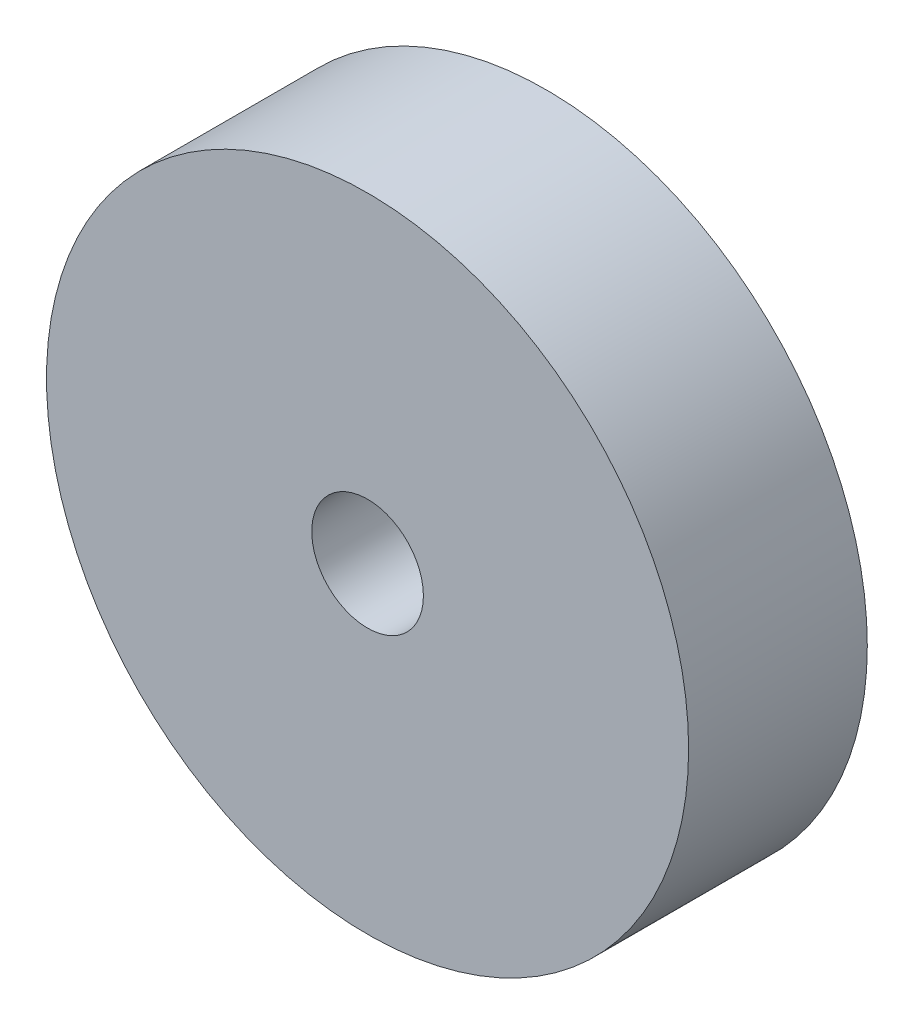
ISO-10303-21;
HEADER;
FILE_DESCRIPTION(('STEP AP214'),'2;1');
FILE_NAME('part.step','',(''),(''),'','','');
FILE_SCHEMA(('AUTOMOTIVE_DESIGN { 1 0 10303 214 1 1 1 1 }'));
ENDSEC;
DATA;
#1=APPLICATION_CONTEXT('core data for automotive mechanical design processes');
#2=APPLICATION_PROTOCOL_DEFINITION('international standard','automotive_design',2000,#1);
#3=PRODUCT_CONTEXT('',#1,'mechanical');
#4=PRODUCT('Part','Part','',(#3));
#5=PRODUCT_RELATED_PRODUCT_CATEGORY('part','',(#4));
#6=PRODUCT_DEFINITION_FORMATION('','',#4);
#7=PRODUCT_DEFINITION_CONTEXT('part definition',#1,'design');
#8=PRODUCT_DEFINITION('design','',#6,#7);
#9=PRODUCT_DEFINITION_SHAPE('','',#8);
#10=(LENGTH_UNIT() NAMED_UNIT(*) SI_UNIT(.MILLI.,.METRE.));
#11=(NAMED_UNIT(*) PLANE_ANGLE_UNIT() SI_UNIT($,.RADIAN.));
#12=(NAMED_UNIT(*) SI_UNIT($,.STERADIAN.) SOLID_ANGLE_UNIT());
#13=UNCERTAINTY_MEASURE_WITH_UNIT(LENGTH_MEASURE(1.E-05),#10,'distance_accuracy_value','');
#14=(GEOMETRIC_REPRESENTATION_CONTEXT(3) GLOBAL_UNCERTAINTY_ASSIGNED_CONTEXT((#13)) GLOBAL_UNIT_ASSIGNED_CONTEXT((#10,
#11,#12)) REPRESENTATION_CONTEXT('',''));
#15=CARTESIAN_POINT('',(0.,0.,0.));
#16=DIRECTION('',(0.,0.,1.));
#17=DIRECTION('',(1.,0.,0.));
#18=AXIS2_PLACEMENT_3D('',#15,#16,#17);
#19=CARTESIAN_POINT('',(0.,0.,20.32));
#20=DIRECTION('',(0.,0.,1.));
#21=DIRECTION('',(1.,0.,0.));
#22=AXIS2_PLACEMENT_3D('',#19,#20,#21);
#23=PLANE('',#22);
#24=CARTESIAN_POINT('',(0.,0.,20.32));
#25=DIRECTION('',(0.,0.,1.));
#26=DIRECTION('',(1.,0.,0.));
#27=AXIS2_PLACEMENT_3D('',#24,#25,#26);
#28=CIRCLE('',#27,36.5125);
#29=CARTESIAN_POINT('',(36.5125,0.,20.32));
#30=VERTEX_POINT('',#29);
#31=EDGE_CURVE('E10',#30,#30,#28,.T.);
#32=ORIENTED_EDGE('',*,*,#31,.T.);
#33=EDGE_LOOP('',(#32));
#34=FACE_BOUND('',#33,.T.);
#35=CARTESIAN_POINT('',(0.,0.,20.32));
#36=DIRECTION('',(0.,0.,1.));
#37=DIRECTION('',(1.,0.,0.));
#38=AXIS2_PLACEMENT_3D('',#35,#36,#37);
#39=CIRCLE('',#38,6.35);
#40=CARTESIAN_POINT('',(6.35,0.,20.32));
#41=VERTEX_POINT('',#40);
#42=EDGE_CURVE('E41',#41,#41,#39,.T.);
#43=ORIENTED_EDGE('',*,*,#42,.F.);
#44=EDGE_LOOP('',(#43));
#45=FACE_BOUND('',#44,.T.);
#46=ADVANCED_FACE('F30',(#34,#45),#23,.T.);
#47=CARTESIAN_POINT('',(0.,0.,0.));
#48=DIRECTION('',(0.,0.,1.));
#49=DIRECTION('',(1.,0.,0.));
#50=AXIS2_PLACEMENT_3D('',#47,#48,#49);
#51=PLANE('',#50);
#52=CARTESIAN_POINT('',(0.,0.,0.));
#53=DIRECTION('',(0.,0.,1.));
#54=DIRECTION('',(1.,0.,0.));
#55=AXIS2_PLACEMENT_3D('',#52,#53,#54);
#56=CIRCLE('',#55,36.5125);
#57=CARTESIAN_POINT('',(36.5125,0.,0.));
#58=VERTEX_POINT('',#57);
#59=EDGE_CURVE('E34',#58,#58,#56,.T.);
#60=ORIENTED_EDGE('',*,*,#59,.F.);
#61=EDGE_LOOP('',(#60));
#62=FACE_BOUND('',#61,.T.);
#63=CARTESIAN_POINT('',(0.,0.,0.));
#64=DIRECTION('',(0.,0.,1.));
#65=DIRECTION('',(1.,0.,0.));
#66=AXIS2_PLACEMENT_3D('',#63,#64,#65);
#67=CIRCLE('',#66,6.35);
#68=CARTESIAN_POINT('',(6.35,0.,0.));
#69=VERTEX_POINT('',#68);
#70=EDGE_CURVE('E43',#69,#69,#67,.T.);
#71=ORIENTED_EDGE('',*,*,#70,.T.);
#72=EDGE_LOOP('',(#71));
#73=FACE_BOUND('',#72,.T.);
#74=ADVANCED_FACE('F53',(#62,#73),#51,.F.);
#75=CARTESIAN_POINT('',(0.,0.,20.32));
#76=DIRECTION('',(0.,0.,-1.));
#77=DIRECTION('',(-1.,0.,0.));
#78=AXIS2_PLACEMENT_3D('',#75,#76,#77);
#79=CYLINDRICAL_SURFACE('',#78,36.5125);
#80=ORIENTED_EDGE('',*,*,#31,.F.);
#81=EDGE_LOOP('',(#80));
#82=FACE_BOUND('',#81,.T.);
#83=ORIENTED_EDGE('',*,*,#59,.T.);
#84=EDGE_LOOP('',(#83));
#85=FACE_BOUND('',#84,.T.);
#86=ADVANCED_FACE('F32',(#82,#85),#79,.T.);
#87=CARTESIAN_POINT('',(0.,0.,20.32));
#88=DIRECTION('',(0.,0.,-1.));
#89=DIRECTION('',(-1.,0.,0.));
#90=AXIS2_PLACEMENT_3D('',#87,#88,#89);
#91=CYLINDRICAL_SURFACE('',#90,6.35);
#92=ORIENTED_EDGE('',*,*,#42,.T.);
#93=EDGE_LOOP('',(#92));
#94=FACE_BOUND('',#93,.T.);
#95=ORIENTED_EDGE('',*,*,#70,.F.);
#96=EDGE_LOOP('',(#95));
#97=FACE_BOUND('',#96,.T.);
#98=ADVANCED_FACE('F49',(#94,#97),#91,.F.);
#99=CLOSED_SHELL('',(#46,#74,#86,#98));
#100=MANIFOLD_SOLID_BREP('B2',#99);
#101=ADVANCED_BREP_SHAPE_REPRESENTATION('',(#18,#100),#14);
#102=SHAPE_DEFINITION_REPRESENTATION(#9,#101);
ENDSEC;
END-ISO-10303-21;
